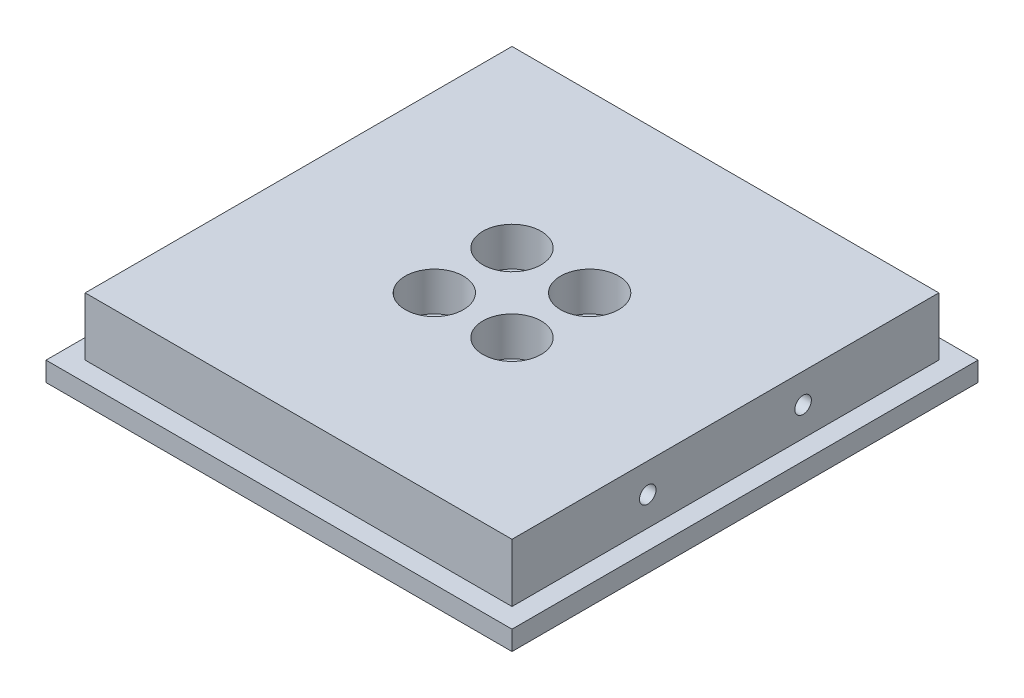
ISO-10303-21;
HEADER;
FILE_DESCRIPTION(('STEP AP214'),'2;1');
FILE_NAME('part.step','',(''),(''),'','','');
FILE_SCHEMA(('AUTOMOTIVE_DESIGN { 1 0 10303 214 1 1 1 1 }'));
ENDSEC;
DATA;
#1=APPLICATION_CONTEXT('core data for automotive mechanical design processes');
#2=APPLICATION_PROTOCOL_DEFINITION('international standard','automotive_design',2000,#1);
#3=PRODUCT_CONTEXT('',#1,'mechanical');
#4=PRODUCT('Part','Part','',(#3));
#5=PRODUCT_RELATED_PRODUCT_CATEGORY('part','',(#4));
#6=PRODUCT_DEFINITION_FORMATION('','',#4);
#7=PRODUCT_DEFINITION_CONTEXT('part definition',#1,'design');
#8=PRODUCT_DEFINITION('design','',#6,#7);
#9=PRODUCT_DEFINITION_SHAPE('','',#8);
#10=(LENGTH_UNIT() NAMED_UNIT(*) SI_UNIT(.MILLI.,.METRE.));
#11=(NAMED_UNIT(*) PLANE_ANGLE_UNIT() SI_UNIT($,.RADIAN.));
#12=(NAMED_UNIT(*) SI_UNIT($,.STERADIAN.) SOLID_ANGLE_UNIT());
#13=UNCERTAINTY_MEASURE_WITH_UNIT(LENGTH_MEASURE(1.E-05),#10,'distance_accuracy_value','');
#14=(GEOMETRIC_REPRESENTATION_CONTEXT(3) GLOBAL_UNCERTAINTY_ASSIGNED_CONTEXT((#13)) GLOBAL_UNIT_ASSIGNED_CONTEXT((#10,
#11,#12)) REPRESENTATION_CONTEXT('',''));
#15=CARTESIAN_POINT('',(0.,0.,0.));
#16=DIRECTION('',(0.,0.,1.));
#17=DIRECTION('',(1.,0.,0.));
#18=AXIS2_PLACEMENT_3D('',#15,#16,#17);
#19=CARTESIAN_POINT('',(-6.35,12.7,6.35));
#20=DIRECTION('',(0.,-1.,0.));
#21=DIRECTION('',(0.,0.,-1.));
#22=AXIS2_PLACEMENT_3D('',#19,#20,#21);
#23=CYLINDRICAL_SURFACE('',#22,2.5527);
#24=CARTESIAN_POINT('',(-6.35,3.175,6.35));
#25=DIRECTION('',(0.,-1.,0.));
#26=DIRECTION('',(0.,0.,-1.));
#27=AXIS2_PLACEMENT_3D('',#24,#25,#26);
#28=CIRCLE('',#27,2.5527);
#29=CARTESIAN_POINT('',(-6.35,3.175,3.7973));
#30=VERTEX_POINT('',#29);
#31=EDGE_CURVE('E204',#30,#30,#28,.T.);
#32=ORIENTED_EDGE('',*,*,#31,.T.);
#33=EDGE_LOOP('',(#32));
#34=FACE_BOUND('',#33,.T.);
#35=CARTESIAN_POINT('',(-6.35,6.35,6.35));
#36=DIRECTION('',(0.,1.,0.));
#37=DIRECTION('',(0.,0.,1.));
#38=AXIS2_PLACEMENT_3D('',#35,#36,#37);
#39=CIRCLE('',#38,2.5527);
#40=CARTESIAN_POINT('',(-6.35,6.35,8.9027));
#41=VERTEX_POINT('',#40);
#42=EDGE_CURVE('E41',#41,#41,#39,.F.);
#43=ORIENTED_EDGE('',*,*,#42,.F.);
#44=EDGE_LOOP('',(#43));
#45=FACE_BOUND('',#44,.T.);
#46=ADVANCED_FACE('F37',(#34,#45),#23,.F.);
#47=CARTESIAN_POINT('',(6.35,12.7,6.35));
#48=DIRECTION('',(0.,-1.,0.));
#49=DIRECTION('',(0.,0.,-1.));
#50=AXIS2_PLACEMENT_3D('',#47,#48,#49);
#51=CYLINDRICAL_SURFACE('',#50,2.5527);
#52=CARTESIAN_POINT('',(6.35,3.175,6.35));
#53=DIRECTION('',(0.,-1.,0.));
#54=DIRECTION('',(0.,0.,-1.));
#55=AXIS2_PLACEMENT_3D('',#52,#53,#54);
#56=CIRCLE('',#55,2.5527);
#57=CARTESIAN_POINT('',(6.35,3.175,3.7973));
#58=VERTEX_POINT('',#57);
#59=EDGE_CURVE('E355',#58,#58,#56,.T.);
#60=ORIENTED_EDGE('',*,*,#59,.T.);
#61=EDGE_LOOP('',(#60));
#62=FACE_BOUND('',#61,.T.);
#63=CARTESIAN_POINT('',(6.35,6.35,6.35));
#64=DIRECTION('',(0.,1.,0.));
#65=DIRECTION('',(0.,0.,1.));
#66=AXIS2_PLACEMENT_3D('',#63,#64,#65);
#67=CIRCLE('',#66,2.5527);
#68=CARTESIAN_POINT('',(6.35,6.35,8.9027));
#69=VERTEX_POINT('',#68);
#70=EDGE_CURVE('E325',#69,#69,#67,.F.);
#71=ORIENTED_EDGE('',*,*,#70,.F.);
#72=EDGE_LOOP('',(#71));
#73=FACE_BOUND('',#72,.T.);
#74=ADVANCED_FACE('F380',(#62,#73),#51,.F.);
#75=CARTESIAN_POINT('',(6.35,12.7,-6.35));
#76=DIRECTION('',(0.,-1.,0.));
#77=DIRECTION('',(0.,0.,-1.));
#78=AXIS2_PLACEMENT_3D('',#75,#76,#77);
#79=CYLINDRICAL_SURFACE('',#78,2.5527);
#80=CARTESIAN_POINT('',(6.35,3.175,-6.35));
#81=DIRECTION('',(0.,-1.,0.));
#82=DIRECTION('',(0.,0.,-1.));
#83=AXIS2_PLACEMENT_3D('',#80,#81,#82);
#84=CIRCLE('',#83,2.5527);
#85=CARTESIAN_POINT('',(6.35,3.175,-8.9027));
#86=VERTEX_POINT('',#85);
#87=EDGE_CURVE('E352',#86,#86,#84,.T.);
#88=ORIENTED_EDGE('',*,*,#87,.T.);
#89=EDGE_LOOP('',(#88));
#90=FACE_BOUND('',#89,.T.);
#91=CARTESIAN_POINT('',(6.35,6.35,-6.35));
#92=DIRECTION('',(0.,1.,0.));
#93=DIRECTION('',(0.,0.,1.));
#94=AXIS2_PLACEMENT_3D('',#91,#92,#93);
#95=CIRCLE('',#94,2.5527);
#96=CARTESIAN_POINT('',(6.35,6.35,-3.7973));
#97=VERTEX_POINT('',#96);
#98=EDGE_CURVE('E321',#97,#97,#95,.F.);
#99=ORIENTED_EDGE('',*,*,#98,.F.);
#100=EDGE_LOOP('',(#99));
#101=FACE_BOUND('',#100,.T.);
#102=ADVANCED_FACE('F384',(#90,#101),#79,.F.);
#103=CARTESIAN_POINT('',(-6.35,12.7,-6.35));
#104=DIRECTION('',(0.,-1.,0.));
#105=DIRECTION('',(0.,0.,-1.));
#106=AXIS2_PLACEMENT_3D('',#103,#104,#105);
#107=CYLINDRICAL_SURFACE('',#106,2.5527);
#108=CARTESIAN_POINT('',(-6.35,3.175,-6.35));
#109=DIRECTION('',(0.,-1.,0.));
#110=DIRECTION('',(0.,0.,-1.));
#111=AXIS2_PLACEMENT_3D('',#108,#109,#110);
#112=CIRCLE('',#111,2.5527);
#113=CARTESIAN_POINT('',(-6.35,3.175,-8.9027));
#114=VERTEX_POINT('',#113);
#115=EDGE_CURVE('E319',#114,#114,#112,.T.);
#116=ORIENTED_EDGE('',*,*,#115,.T.);
#117=EDGE_LOOP('',(#116));
#118=FACE_BOUND('',#117,.T.);
#119=CARTESIAN_POINT('',(-6.35,6.35,-6.35));
#120=DIRECTION('',(0.,1.,0.));
#121=DIRECTION('',(0.,0.,1.));
#122=AXIS2_PLACEMENT_3D('',#119,#120,#121);
#123=CIRCLE('',#122,2.5527);
#124=CARTESIAN_POINT('',(-6.35,6.35,-3.7973));
#125=VERTEX_POINT('',#124);
#126=EDGE_CURVE('E316',#125,#125,#123,.F.);
#127=ORIENTED_EDGE('',*,*,#126,.F.);
#128=EDGE_LOOP('',(#127));
#129=FACE_BOUND('',#128,.T.);
#130=ADVANCED_FACE('F390',(#118,#129),#107,.F.);
#131=CARTESIAN_POINT('',(0.,0.,0.));
#132=DIRECTION('',(0.,-1.,0.));
#133=DIRECTION('',(0.,0.,-1.));
#134=AXIS2_PLACEMENT_3D('',#131,#132,#133);
#135=PLANE('',#134);
#136=DIRECTION('',(0.,0.,-1.));
#137=VECTOR('',#136,1.);
#138=CARTESIAN_POINT('',(38.1,0.,38.1));
#139=LINE('',#138,#137);
#140=CARTESIAN_POINT('',(38.1,0.,38.1));
#141=VERTEX_POINT('',#140);
#142=CARTESIAN_POINT('',(38.1,0.,-38.1));
#143=VERTEX_POINT('',#142);
#144=EDGE_CURVE('E290',#141,#143,#139,.T.);
#145=ORIENTED_EDGE('',*,*,#144,.F.);
#146=DIRECTION('',(1.,0.,0.));
#147=VECTOR('',#146,1.);
#148=CARTESIAN_POINT('',(-38.1,0.,38.1));
#149=LINE('',#148,#147);
#150=CARTESIAN_POINT('',(-38.1,0.,38.1));
#151=VERTEX_POINT('',#150);
#152=EDGE_CURVE('E295',#151,#141,#149,.T.);
#153=ORIENTED_EDGE('',*,*,#152,.F.);
#154=DIRECTION('',(0.,0.,1.));
#155=VECTOR('',#154,1.);
#156=CARTESIAN_POINT('',(-38.1,0.,38.1));
#157=LINE('',#156,#155);
#158=CARTESIAN_POINT('',(-38.1,0.,-38.1));
#159=VERTEX_POINT('',#158);
#160=EDGE_CURVE('E306',#159,#151,#157,.T.);
#161=ORIENTED_EDGE('',*,*,#160,.F.);
#162=DIRECTION('',(-1.,0.,0.));
#163=VECTOR('',#162,1.);
#164=CARTESIAN_POINT('',(-38.1,0.,-38.1));
#165=LINE('',#164,#163);
#166=EDGE_CURVE('E304',#143,#159,#165,.T.);
#167=ORIENTED_EDGE('',*,*,#166,.F.);
#168=EDGE_LOOP('',(#145,#153,#161,#167));
#169=FACE_BOUND('',#168,.T.);
#170=CARTESIAN_POINT('',(-12.7,0.,-7.9375));
#171=DIRECTION('',(0.,-1.,0.));
#172=DIRECTION('',(0.,0.,-1.));
#173=AXIS2_PLACEMENT_3D('',#170,#171,#172);
#174=CIRCLE('',#173,4.7625);
#175=CARTESIAN_POINT('',(-12.7,0.,-3.175));
#176=VERTEX_POINT('',#175);
#177=CARTESIAN_POINT('',(-12.7,0.,-12.7));
#178=VERTEX_POINT('',#177);
#179=EDGE_CURVE('E203',#176,#178,#174,.T.);
#180=ORIENTED_EDGE('',*,*,#179,.F.);
#181=DIRECTION('',(0.,0.,1.));
#182=VECTOR('',#181,1.);
#183=CARTESIAN_POINT('',(-12.7,0.,0.));
#184=LINE('',#183,#182);
#185=CARTESIAN_POINT('',(-12.7,0.,12.7));
#186=VERTEX_POINT('',#185);
#187=EDGE_CURVE('E54',#176,#186,#184,.T.);
#188=ORIENTED_EDGE('',*,*,#187,.T.);
#189=CARTESIAN_POINT('',(-7.9375,0.,12.7));
#190=DIRECTION('',(0.,-1.,0.));
#191=DIRECTION('',(0.,0.,-1.));
#192=AXIS2_PLACEMENT_3D('',#189,#190,#191);
#193=CIRCLE('',#192,4.7625);
#194=CARTESIAN_POINT('',(-3.175,0.,12.7));
#195=VERTEX_POINT('',#194);
#196=EDGE_CURVE('E181',#195,#186,#193,.T.);
#197=ORIENTED_EDGE('',*,*,#196,.F.);
#198=DIRECTION('',(1.,0.,0.));
#199=VECTOR('',#198,1.);
#200=CARTESIAN_POINT('',(0.,0.,12.7));
#201=LINE('',#200,#199);
#202=CARTESIAN_POINT('',(12.7,0.,12.7));
#203=VERTEX_POINT('',#202);
#204=EDGE_CURVE('E218',#195,#203,#201,.T.);
#205=ORIENTED_EDGE('',*,*,#204,.T.);
#206=CARTESIAN_POINT('',(12.7,0.,7.9375));
#207=DIRECTION('',(0.,-1.,0.));
#208=DIRECTION('',(0.,0.,-1.));
#209=AXIS2_PLACEMENT_3D('',#206,#207,#208);
#210=CIRCLE('',#209,4.7625);
#211=CARTESIAN_POINT('',(12.7,0.,3.175));
#212=VERTEX_POINT('',#211);
#213=EDGE_CURVE('E215',#212,#203,#210,.T.);
#214=ORIENTED_EDGE('',*,*,#213,.F.);
#215=DIRECTION('',(0.,0.,1.));
#216=VECTOR('',#215,1.);
#217=CARTESIAN_POINT('',(12.7,0.,0.));
#218=LINE('',#217,#216);
#219=CARTESIAN_POINT('',(12.7,0.,-12.7));
#220=VERTEX_POINT('',#219);
#221=EDGE_CURVE('E212',#220,#212,#218,.T.);
#222=ORIENTED_EDGE('',*,*,#221,.F.);
#223=CARTESIAN_POINT('',(7.9375,0.,-12.7));
#224=DIRECTION('',(0.,-1.,0.));
#225=DIRECTION('',(0.,0.,-1.));
#226=AXIS2_PLACEMENT_3D('',#223,#224,#225);
#227=CIRCLE('',#226,4.7625);
#228=CARTESIAN_POINT('',(3.175,0.,-12.7));
#229=VERTEX_POINT('',#228);
#230=EDGE_CURVE('E209',#229,#220,#227,.T.);
#231=ORIENTED_EDGE('',*,*,#230,.F.);
#232=DIRECTION('',(1.,0.,0.));
#233=VECTOR('',#232,1.);
#234=CARTESIAN_POINT('',(0.,0.,-12.7));
#235=LINE('',#234,#233);
#236=EDGE_CURVE('E206',#178,#229,#235,.T.);
#237=ORIENTED_EDGE('',*,*,#236,.F.);
#238=EDGE_LOOP('',(#180,#188,#197,#205,#214,#222,#231,#237));
#239=FACE_BOUND('',#238,.T.);
#240=ADVANCED_FACE('F394',(#169,#239),#135,.T.);
#241=CARTESIAN_POINT('',(38.1,3.175,38.1));
#242=DIRECTION('',(-1.,0.,0.));
#243=DIRECTION('',(0.,0.,1.));
#244=AXIS2_PLACEMENT_3D('',#241,#242,#243);
#245=PLANE('',#244);
#246=ORIENTED_EDGE('',*,*,#144,.T.);
#247=DIRECTION('',(0.,-1.,0.));
#248=VECTOR('',#247,1.);
#249=CARTESIAN_POINT('',(38.1,3.175,-38.1));
#250=LINE('',#249,#248);
#251=CARTESIAN_POINT('',(38.1,3.175,-38.1));
#252=VERTEX_POINT('',#251);
#253=EDGE_CURVE('E11',#252,#143,#250,.T.);
#254=ORIENTED_EDGE('',*,*,#253,.F.);
#255=DIRECTION('',(0.,0.,-1.));
#256=VECTOR('',#255,1.);
#257=CARTESIAN_POINT('',(38.1,3.175,38.1));
#258=LINE('',#257,#256);
#259=CARTESIAN_POINT('',(38.1,3.175,38.1));
#260=VERTEX_POINT('',#259);
#261=EDGE_CURVE('E291',#260,#252,#258,.T.);
#262=ORIENTED_EDGE('',*,*,#261,.F.);
#263=DIRECTION('',(0.,-1.,0.));
#264=VECTOR('',#263,1.);
#265=CARTESIAN_POINT('',(38.1,3.175,38.1));
#266=LINE('',#265,#264);
#267=EDGE_CURVE('E301',#260,#141,#266,.T.);
#268=ORIENTED_EDGE('',*,*,#267,.T.);
#269=EDGE_LOOP('',(#246,#254,#262,#268));
#270=FACE_BOUND('',#269,.T.);
#271=ADVANCED_FACE('F39',(#270),#245,.F.);
#272=CARTESIAN_POINT('',(-38.1,3.175,-38.1));
#273=DIRECTION('',(0.,0.,1.));
#274=DIRECTION('',(1.,0.,0.));
#275=AXIS2_PLACEMENT_3D('',#272,#273,#274);
#276=PLANE('',#275);
#277=ORIENTED_EDGE('',*,*,#166,.T.);
#278=DIRECTION('',(0.,-1.,0.));
#279=VECTOR('',#278,1.);
#280=CARTESIAN_POINT('',(-38.1,3.175,-38.1));
#281=LINE('',#280,#279);
#282=CARTESIAN_POINT('',(-38.1,3.175,-38.1));
#283=VERTEX_POINT('',#282);
#284=EDGE_CURVE('E46',#283,#159,#281,.T.);
#285=ORIENTED_EDGE('',*,*,#284,.F.);
#286=DIRECTION('',(-1.,0.,0.));
#287=VECTOR('',#286,1.);
#288=CARTESIAN_POINT('',(-38.1,3.175,-38.1));
#289=LINE('',#288,#287);
#290=EDGE_CURVE('E294',#252,#283,#289,.T.);
#291=ORIENTED_EDGE('',*,*,#290,.F.);
#292=ORIENTED_EDGE('',*,*,#253,.T.);
#293=EDGE_LOOP('',(#277,#285,#291,#292));
#294=FACE_BOUND('',#293,.T.);
#295=ADVANCED_FACE('F472',(#294),#276,.F.);
#296=CARTESIAN_POINT('',(-38.1,3.175,38.1));
#297=DIRECTION('',(1.,0.,0.));
#298=DIRECTION('',(0.,0.,-1.));
#299=AXIS2_PLACEMENT_3D('',#296,#297,#298);
#300=PLANE('',#299);
#301=ORIENTED_EDGE('',*,*,#160,.T.);
#302=DIRECTION('',(0.,-1.,0.));
#303=VECTOR('',#302,1.);
#304=CARTESIAN_POINT('',(-38.1,3.175,38.1));
#305=LINE('',#304,#303);
#306=CARTESIAN_POINT('',(-38.1,3.175,38.1));
#307=VERTEX_POINT('',#306);
#308=EDGE_CURVE('E311',#307,#151,#305,.T.);
#309=ORIENTED_EDGE('',*,*,#308,.F.);
#310=DIRECTION('',(0.,0.,1.));
#311=VECTOR('',#310,1.);
#312=CARTESIAN_POINT('',(-38.1,3.175,38.1));
#313=LINE('',#312,#311);
#314=EDGE_CURVE('E297',#283,#307,#313,.T.);
#315=ORIENTED_EDGE('',*,*,#314,.F.);
#316=ORIENTED_EDGE('',*,*,#284,.T.);
#317=EDGE_LOOP('',(#301,#309,#315,#316));
#318=FACE_BOUND('',#317,.T.);
#319=ADVANCED_FACE('F477',(#318),#300,.F.);
#320=CARTESIAN_POINT('',(-38.1,3.175,38.1));
#321=DIRECTION('',(0.,0.,-1.));
#322=DIRECTION('',(-1.,0.,0.));
#323=AXIS2_PLACEMENT_3D('',#320,#321,#322);
#324=PLANE('',#323);
#325=ORIENTED_EDGE('',*,*,#152,.T.);
#326=ORIENTED_EDGE('',*,*,#267,.F.);
#327=DIRECTION('',(1.,0.,0.));
#328=VECTOR('',#327,1.);
#329=CARTESIAN_POINT('',(-38.1,3.175,38.1));
#330=LINE('',#329,#328);
#331=EDGE_CURVE('E299',#307,#260,#330,.T.);
#332=ORIENTED_EDGE('',*,*,#331,.F.);
#333=ORIENTED_EDGE('',*,*,#308,.T.);
#334=EDGE_LOOP('',(#325,#326,#332,#333));
#335=FACE_BOUND('',#334,.T.);
#336=ADVANCED_FACE('F462',(#335),#324,.F.);
#337=CARTESIAN_POINT('',(0.,3.175,0.));
#338=DIRECTION('',(0.,-1.,0.));
#339=DIRECTION('',(0.,0.,-1.));
#340=AXIS2_PLACEMENT_3D('',#337,#338,#339);
#341=PLANE('',#340);
#342=DIRECTION('',(-1.,0.,0.));
#343=VECTOR('',#342,1.);
#344=CARTESIAN_POINT('',(0.,3.175,34.89706));
#345=LINE('',#344,#343);
#346=CARTESIAN_POINT('',(34.89706,3.175,34.89706));
#347=VERTEX_POINT('',#346);
#348=CARTESIAN_POINT('',(-34.89706,3.175,34.89706));
#349=VERTEX_POINT('',#348);
#350=EDGE_CURVE('E62',#347,#349,#345,.T.);
#351=ORIENTED_EDGE('',*,*,#350,.T.);
#352=DIRECTION('',(0.,0.,-1.));
#353=VECTOR('',#352,1.);
#354=CARTESIAN_POINT('',(-34.89706,3.175,0.));
#355=LINE('',#354,#353);
#356=CARTESIAN_POINT('',(-34.89706,3.175,-34.89706));
#357=VERTEX_POINT('',#356);
#358=EDGE_CURVE('E260',#349,#357,#355,.T.);
#359=ORIENTED_EDGE('',*,*,#358,.T.);
#360=DIRECTION('',(-1.,0.,0.));
#361=VECTOR('',#360,1.);
#362=CARTESIAN_POINT('',(0.,3.175,-34.89706));
#363=LINE('',#362,#361);
#364=CARTESIAN_POINT('',(34.89706,3.175,-34.89706));
#365=VERTEX_POINT('',#364);
#366=EDGE_CURVE('E265',#365,#357,#363,.T.);
#367=ORIENTED_EDGE('',*,*,#366,.F.);
#368=DIRECTION('',(0.,0.,-1.));
#369=VECTOR('',#368,1.);
#370=CARTESIAN_POINT('',(34.89706,3.175,0.));
#371=LINE('',#370,#369);
#372=EDGE_CURVE('E275',#347,#365,#371,.T.);
#373=ORIENTED_EDGE('',*,*,#372,.F.);
#374=EDGE_LOOP('',(#351,#359,#367,#373));
#375=FACE_BOUND('',#374,.T.);
#376=ORIENTED_EDGE('',*,*,#261,.T.);
#377=ORIENTED_EDGE('',*,*,#290,.T.);
#378=ORIENTED_EDGE('',*,*,#314,.T.);
#379=ORIENTED_EDGE('',*,*,#331,.T.);
#380=EDGE_LOOP('',(#376,#377,#378,#379));
#381=FACE_BOUND('',#380,.T.);
#382=ADVANCED_FACE('F459',(#375,#381),#341,.F.);
#383=CARTESIAN_POINT('',(-34.89706,12.7,0.));
#384=DIRECTION('',(-1.,0.,0.));
#385=DIRECTION('',(0.,0.,1.));
#386=AXIS2_PLACEMENT_3D('',#383,#384,#385);
#387=PLANE('',#386);
#388=CARTESIAN_POINT('',(-34.89706,7.9375,12.7));
#389=DIRECTION('',(-1.,0.,0.));
#390=DIRECTION('',(0.,0.,1.));
#391=AXIS2_PLACEMENT_3D('',#388,#389,#390);
#392=CIRCLE('',#391,1.35255);
#393=CARTESIAN_POINT('',(-34.89706,7.9375,14.05255));
#394=VERTEX_POINT('',#393);
#395=EDGE_CURVE('E225',#394,#394,#392,.T.);
#396=ORIENTED_EDGE('',*,*,#395,.F.);
#397=EDGE_LOOP('',(#396));
#398=FACE_BOUND('',#397,.T.);
#399=CARTESIAN_POINT('',(-34.89706,7.9375,-12.7));
#400=DIRECTION('',(-1.,0.,0.));
#401=DIRECTION('',(0.,0.,1.));
#402=AXIS2_PLACEMENT_3D('',#399,#400,#401);
#403=CIRCLE('',#402,1.35255);
#404=CARTESIAN_POINT('',(-34.89706,7.9375,-11.34745));
#405=VERTEX_POINT('',#404);
#406=EDGE_CURVE('E242',#405,#405,#403,.T.);
#407=ORIENTED_EDGE('',*,*,#406,.F.);
#408=EDGE_LOOP('',(#407));
#409=FACE_BOUND('',#408,.T.);
#410=ORIENTED_EDGE('',*,*,#358,.F.);
#411=DIRECTION('',(0.,-1.,0.));
#412=VECTOR('',#411,1.);
#413=CARTESIAN_POINT('',(-34.89706,12.7,34.89706));
#414=LINE('',#413,#412);
#415=CARTESIAN_POINT('',(-34.89706,12.7,34.89706));
#416=VERTEX_POINT('',#415);
#417=EDGE_CURVE('E288',#416,#349,#414,.T.);
#418=ORIENTED_EDGE('',*,*,#417,.F.);
#419=DIRECTION('',(0.,0.,-1.));
#420=VECTOR('',#419,1.);
#421=CARTESIAN_POINT('',(-34.89706,12.7,0.));
#422=LINE('',#421,#420);
#423=CARTESIAN_POINT('',(-34.89706,12.7,-34.89706));
#424=VERTEX_POINT('',#423);
#425=EDGE_CURVE('E261',#416,#424,#422,.T.);
#426=ORIENTED_EDGE('',*,*,#425,.T.);
#427=DIRECTION('',(0.,-1.,0.));
#428=VECTOR('',#427,1.);
#429=CARTESIAN_POINT('',(-34.89706,12.7,-34.89706));
#430=LINE('',#429,#428);
#431=EDGE_CURVE('E272',#424,#357,#430,.T.);
#432=ORIENTED_EDGE('',*,*,#431,.T.);
#433=EDGE_LOOP('',(#410,#418,#426,#432));
#434=FACE_BOUND('',#433,.T.);
#435=ADVANCED_FACE('F458',(#398,#409,#434),#387,.T.);
#436=CARTESIAN_POINT('',(0.,12.7,34.89706));
#437=DIRECTION('',(0.,0.,1.));
#438=DIRECTION('',(1.,0.,0.));
#439=AXIS2_PLACEMENT_3D('',#436,#437,#438);
#440=PLANE('',#439);
#441=ORIENTED_EDGE('',*,*,#350,.F.);
#442=DIRECTION('',(0.,-1.,0.));
#443=VECTOR('',#442,1.);
#444=CARTESIAN_POINT('',(34.89706,12.7,34.89706));
#445=LINE('',#444,#443);
#446=CARTESIAN_POINT('',(34.89706,12.7,34.89706));
#447=VERTEX_POINT('',#446);
#448=EDGE_CURVE('E285',#447,#347,#445,.T.);
#449=ORIENTED_EDGE('',*,*,#448,.F.);
#450=DIRECTION('',(-1.,0.,0.));
#451=VECTOR('',#450,1.);
#452=CARTESIAN_POINT('',(0.,12.7,34.89706));
#453=LINE('',#452,#451);
#454=EDGE_CURVE('E264',#447,#416,#453,.T.);
#455=ORIENTED_EDGE('',*,*,#454,.T.);
#456=ORIENTED_EDGE('',*,*,#417,.T.);
#457=EDGE_LOOP('',(#441,#449,#455,#456));
#458=FACE_BOUND('',#457,.T.);
#459=ADVANCED_FACE('F451',(#458),#440,.T.);
#460=CARTESIAN_POINT('',(34.89706,12.7,0.));
#461=DIRECTION('',(-1.,0.,0.));
#462=DIRECTION('',(0.,0.,1.));
#463=AXIS2_PLACEMENT_3D('',#460,#461,#462);
#464=PLANE('',#463);
#465=CARTESIAN_POINT('',(34.89706,7.9375,-12.7));
#466=DIRECTION('',(1.,0.,0.));
#467=DIRECTION('',(0.,0.,-1.));
#468=AXIS2_PLACEMENT_3D('',#465,#466,#467);
#469=CIRCLE('',#468,1.35255);
#470=CARTESIAN_POINT('',(34.89706,7.9375,-14.05255));
#471=VERTEX_POINT('',#470);
#472=EDGE_CURVE('E248',#471,#471,#469,.T.);
#473=ORIENTED_EDGE('',*,*,#472,.F.);
#474=EDGE_LOOP('',(#473));
#475=FACE_BOUND('',#474,.T.);
#476=CARTESIAN_POINT('',(34.89706,7.9375,12.7));
#477=DIRECTION('',(1.,0.,0.));
#478=DIRECTION('',(0.,0.,-1.));
#479=AXIS2_PLACEMENT_3D('',#476,#477,#478);
#480=CIRCLE('',#479,1.35255);
#481=CARTESIAN_POINT('',(34.89706,7.9375,11.34745));
#482=VERTEX_POINT('',#481);
#483=EDGE_CURVE('E254',#482,#482,#480,.T.);
#484=ORIENTED_EDGE('',*,*,#483,.F.);
#485=EDGE_LOOP('',(#484));
#486=FACE_BOUND('',#485,.T.);
#487=ORIENTED_EDGE('',*,*,#372,.T.);
#488=DIRECTION('',(0.,-1.,0.));
#489=VECTOR('',#488,1.);
#490=CARTESIAN_POINT('',(34.89706,12.7,-34.89706));
#491=LINE('',#490,#489);
#492=CARTESIAN_POINT('',(34.89706,12.7,-34.89706));
#493=VERTEX_POINT('',#492);
#494=EDGE_CURVE('E282',#493,#365,#491,.T.);
#495=ORIENTED_EDGE('',*,*,#494,.F.);
#496=DIRECTION('',(0.,0.,-1.));
#497=VECTOR('',#496,1.);
#498=CARTESIAN_POINT('',(34.89706,12.7,0.));
#499=LINE('',#498,#497);
#500=EDGE_CURVE('E268',#447,#493,#499,.T.);
#501=ORIENTED_EDGE('',*,*,#500,.F.);
#502=ORIENTED_EDGE('',*,*,#448,.T.);
#503=EDGE_LOOP('',(#487,#495,#501,#502));
#504=FACE_BOUND('',#503,.T.);
#505=ADVANCED_FACE('F456',(#475,#486,#504),#464,.F.);
#506=CARTESIAN_POINT('',(0.,12.7,-34.89706));
#507=DIRECTION('',(0.,0.,1.));
#508=DIRECTION('',(1.,0.,0.));
#509=AXIS2_PLACEMENT_3D('',#506,#507,#508);
#510=PLANE('',#509);
#511=ORIENTED_EDGE('',*,*,#366,.T.);
#512=ORIENTED_EDGE('',*,*,#431,.F.);
#513=DIRECTION('',(-1.,0.,0.));
#514=VECTOR('',#513,1.);
#515=CARTESIAN_POINT('',(0.,12.7,-34.89706));
#516=LINE('',#515,#514);
#517=EDGE_CURVE('E270',#493,#424,#516,.T.);
#518=ORIENTED_EDGE('',*,*,#517,.F.);
#519=ORIENTED_EDGE('',*,*,#494,.T.);
#520=EDGE_LOOP('',(#511,#512,#518,#519));
#521=FACE_BOUND('',#520,.T.);
#522=ADVANCED_FACE('F437',(#521),#510,.F.);
#523=CARTESIAN_POINT('',(0.,12.7,0.));
#524=DIRECTION('',(0.,1.,0.));
#525=DIRECTION('',(0.,0.,1.));
#526=AXIS2_PLACEMENT_3D('',#523,#524,#525);
#527=PLANE('',#526);
#528=CARTESIAN_POINT('',(-6.35,12.7,6.35));
#529=DIRECTION('',(0.,1.,0.));
#530=DIRECTION('',(0.,0.,1.));
#531=AXIS2_PLACEMENT_3D('',#528,#529,#530);
#532=CIRCLE('',#531,4.7625);
#533=CARTESIAN_POINT('',(-6.35,12.7,11.1125));
#534=VERTEX_POINT('',#533);
#535=EDGE_CURVE('E341',#534,#534,#532,.T.);
#536=ORIENTED_EDGE('',*,*,#535,.F.);
#537=EDGE_LOOP('',(#536));
#538=FACE_BOUND('',#537,.T.);
#539=CARTESIAN_POINT('',(6.35,12.7,6.35));
#540=DIRECTION('',(0.,1.,0.));
#541=DIRECTION('',(0.,0.,1.));
#542=AXIS2_PLACEMENT_3D('',#539,#540,#541);
#543=CIRCLE('',#542,4.7625);
#544=CARTESIAN_POINT('',(6.35,12.7,11.1125));
#545=VERTEX_POINT('',#544);
#546=EDGE_CURVE('E334',#545,#545,#543,.T.);
#547=ORIENTED_EDGE('',*,*,#546,.F.);
#548=EDGE_LOOP('',(#547));
#549=FACE_BOUND('',#548,.T.);
#550=CARTESIAN_POINT('',(6.35,12.7,-6.35));
#551=DIRECTION('',(0.,1.,0.));
#552=DIRECTION('',(0.,0.,1.));
#553=AXIS2_PLACEMENT_3D('',#550,#551,#552);
#554=CIRCLE('',#553,4.7625);
#555=CARTESIAN_POINT('',(6.35,12.7,-1.5875));
#556=VERTEX_POINT('',#555);
#557=EDGE_CURVE('E327',#556,#556,#554,.T.);
#558=ORIENTED_EDGE('',*,*,#557,.F.);
#559=EDGE_LOOP('',(#558));
#560=FACE_BOUND('',#559,.T.);
#561=CARTESIAN_POINT('',(-6.35,12.7,-6.35));
#562=DIRECTION('',(0.,1.,0.));
#563=DIRECTION('',(0.,0.,1.));
#564=AXIS2_PLACEMENT_3D('',#561,#562,#563);
#565=CIRCLE('',#564,4.7625);
#566=CARTESIAN_POINT('',(-6.35,12.7,-1.5875));
#567=VERTEX_POINT('',#566);
#568=EDGE_CURVE('E323',#567,#567,#565,.T.);
#569=ORIENTED_EDGE('',*,*,#568,.F.);
#570=EDGE_LOOP('',(#569));
#571=FACE_BOUND('',#570,.T.);
#572=ORIENTED_EDGE('',*,*,#425,.F.);
#573=ORIENTED_EDGE('',*,*,#454,.F.);
#574=ORIENTED_EDGE('',*,*,#500,.T.);
#575=ORIENTED_EDGE('',*,*,#517,.T.);
#576=EDGE_LOOP('',(#572,#573,#574,#575));
#577=FACE_BOUND('',#576,.T.);
#578=ADVANCED_FACE('F433',(#538,#549,#560,#571,#577),#527,.T.);
#579=CARTESIAN_POINT('',(23.72106,7.9375,12.7));
#580=DIRECTION('',(1.,0.,0.));
#581=DIRECTION('',(0.,0.,-1.));
#582=AXIS2_PLACEMENT_3D('',#579,#580,#581);
#583=CONICAL_SURFACE('',#582,1.35255,1.02974425867665);
#584=CARTESIAN_POINT('',(22.9083659697343,7.9375,12.7));
#585=VERTEX_POINT('',#584);
#586=VERTEX_LOOP('',#585);
#587=FACE_BOUND('',#586,.T.);
#588=CARTESIAN_POINT('',(23.72106,7.9375,12.7));
#589=DIRECTION('',(1.,0.,0.));
#590=DIRECTION('',(0.,0.,-1.));
#591=AXIS2_PLACEMENT_3D('',#588,#589,#590);
#592=CIRCLE('',#591,1.35255);
#593=CARTESIAN_POINT('',(23.72106,7.9375,11.34745));
#594=VERTEX_POINT('',#593);
#595=EDGE_CURVE('E257',#594,#594,#592,.T.);
#596=ORIENTED_EDGE('',*,*,#595,.T.);
#597=EDGE_LOOP('',(#596));
#598=FACE_BOUND('',#597,.T.);
#599=ADVANCED_FACE('F436',(#587,#598),#583,.F.);
#600=CARTESIAN_POINT('',(34.89706,7.9375,12.7));
#601=DIRECTION('',(1.,0.,0.));
#602=DIRECTION('',(0.,0.,-1.));
#603=AXIS2_PLACEMENT_3D('',#600,#601,#602);
#604=CYLINDRICAL_SURFACE('',#603,1.35255);
#605=ORIENTED_EDGE('',*,*,#595,.F.);
#606=EDGE_LOOP('',(#605));
#607=FACE_BOUND('',#606,.T.);
#608=ORIENTED_EDGE('',*,*,#483,.T.);
#609=EDGE_LOOP('',(#608));
#610=FACE_BOUND('',#609,.T.);
#611=ADVANCED_FACE('F544',(#607,#610),#604,.F.);
#612=CARTESIAN_POINT('',(23.72106,7.9375,-12.7));
#613=DIRECTION('',(1.,0.,0.));
#614=DIRECTION('',(0.,0.,-1.));
#615=AXIS2_PLACEMENT_3D('',#612,#613,#614);
#616=CONICAL_SURFACE('',#615,1.35255,1.02974425867665);
#617=CARTESIAN_POINT('',(22.9083659697343,7.9375,-12.7));
#618=VERTEX_POINT('',#617);
#619=VERTEX_LOOP('',#618);
#620=FACE_BOUND('',#619,.T.);
#621=CARTESIAN_POINT('',(23.72106,7.9375,-12.7));
#622=DIRECTION('',(1.,0.,0.));
#623=DIRECTION('',(0.,0.,-1.));
#624=AXIS2_PLACEMENT_3D('',#621,#622,#623);
#625=CIRCLE('',#624,1.35255);
#626=CARTESIAN_POINT('',(23.72106,7.9375,-14.05255));
#627=VERTEX_POINT('',#626);
#628=EDGE_CURVE('E251',#627,#627,#625,.T.);
#629=ORIENTED_EDGE('',*,*,#628,.T.);
#630=EDGE_LOOP('',(#629));
#631=FACE_BOUND('',#630,.T.);
#632=ADVANCED_FACE('F540',(#620,#631),#616,.F.);
#633=CARTESIAN_POINT('',(34.89706,7.9375,-12.7));
#634=DIRECTION('',(1.,0.,0.));
#635=DIRECTION('',(0.,0.,-1.));
#636=AXIS2_PLACEMENT_3D('',#633,#634,#635);
#637=CYLINDRICAL_SURFACE('',#636,1.35255);
#638=ORIENTED_EDGE('',*,*,#628,.F.);
#639=EDGE_LOOP('',(#638));
#640=FACE_BOUND('',#639,.T.);
#641=ORIENTED_EDGE('',*,*,#472,.T.);
#642=EDGE_LOOP('',(#641));
#643=FACE_BOUND('',#642,.T.);
#644=ADVANCED_FACE('F536',(#640,#643),#637,.F.);
#645=CARTESIAN_POINT('',(-23.72106,7.9375,-12.7));
#646=DIRECTION('',(-1.,0.,0.));
#647=DIRECTION('',(0.,0.,1.));
#648=AXIS2_PLACEMENT_3D('',#645,#646,#647);
#649=CONICAL_SURFACE('',#648,1.35255,1.02974425867665);
#650=CARTESIAN_POINT('',(-22.9083659697343,7.9375,-12.7));
#651=VERTEX_POINT('',#650);
#652=VERTEX_LOOP('',#651);
#653=FACE_BOUND('',#652,.T.);
#654=CARTESIAN_POINT('',(-23.72106,7.9375,-12.7));
#655=DIRECTION('',(-1.,0.,0.));
#656=DIRECTION('',(0.,0.,1.));
#657=AXIS2_PLACEMENT_3D('',#654,#655,#656);
#658=CIRCLE('',#657,1.35255);
#659=CARTESIAN_POINT('',(-23.72106,7.9375,-11.34745));
#660=VERTEX_POINT('',#659);
#661=EDGE_CURVE('E245',#660,#660,#658,.T.);
#662=ORIENTED_EDGE('',*,*,#661,.T.);
#663=EDGE_LOOP('',(#662));
#664=FACE_BOUND('',#663,.T.);
#665=ADVANCED_FACE('F532',(#653,#664),#649,.F.);
#666=CARTESIAN_POINT('',(-34.89706,7.9375,-12.7));
#667=DIRECTION('',(-1.,0.,0.));
#668=DIRECTION('',(0.,0.,1.));
#669=AXIS2_PLACEMENT_3D('',#666,#667,#668);
#670=CYLINDRICAL_SURFACE('',#669,1.35255);
#671=ORIENTED_EDGE('',*,*,#661,.F.);
#672=EDGE_LOOP('',(#671));
#673=FACE_BOUND('',#672,.T.);
#674=ORIENTED_EDGE('',*,*,#406,.T.);
#675=EDGE_LOOP('',(#674));
#676=FACE_BOUND('',#675,.T.);
#677=ADVANCED_FACE('F528',(#673,#676),#670,.F.);
#678=CARTESIAN_POINT('',(-23.72106,7.9375,12.7));
#679=DIRECTION('',(-1.,0.,0.));
#680=DIRECTION('',(0.,0.,1.));
#681=AXIS2_PLACEMENT_3D('',#678,#679,#680);
#682=CONICAL_SURFACE('',#681,1.35255,1.02974425867665);
#683=CARTESIAN_POINT('',(-22.9083659697343,7.9375,12.7));
#684=VERTEX_POINT('',#683);
#685=VERTEX_LOOP('',#684);
#686=FACE_BOUND('',#685,.T.);
#687=CARTESIAN_POINT('',(-23.72106,7.9375,12.7));
#688=DIRECTION('',(-1.,0.,0.));
#689=DIRECTION('',(0.,0.,1.));
#690=AXIS2_PLACEMENT_3D('',#687,#688,#689);
#691=CIRCLE('',#690,1.35255);
#692=CARTESIAN_POINT('',(-23.72106,7.9375,14.05255));
#693=VERTEX_POINT('',#692);
#694=EDGE_CURVE('E239',#693,#693,#691,.T.);
#695=ORIENTED_EDGE('',*,*,#694,.T.);
#696=EDGE_LOOP('',(#695));
#697=FACE_BOUND('',#696,.T.);
#698=ADVANCED_FACE('F524',(#686,#697),#682,.F.);
#699=CARTESIAN_POINT('',(-34.89706,7.9375,12.7));
#700=DIRECTION('',(-1.,0.,0.));
#701=DIRECTION('',(0.,0.,1.));
#702=AXIS2_PLACEMENT_3D('',#699,#700,#701);
#703=CYLINDRICAL_SURFACE('',#702,1.35255);
#704=ORIENTED_EDGE('',*,*,#694,.F.);
#705=EDGE_LOOP('',(#704));
#706=FACE_BOUND('',#705,.T.);
#707=ORIENTED_EDGE('',*,*,#395,.T.);
#708=EDGE_LOOP('',(#707));
#709=FACE_BOUND('',#708,.T.);
#710=ADVANCED_FACE('F521',(#706,#709),#703,.F.);
#711=CARTESIAN_POINT('',(-12.7,3.175,0.));
#712=DIRECTION('',(1.,0.,0.));
#713=DIRECTION('',(0.,0.,-1.));
#714=AXIS2_PLACEMENT_3D('',#711,#712,#713);
#715=PLANE('',#714);
#716=ORIENTED_EDGE('',*,*,#187,.F.);
#717=DIRECTION('',(0.,-1.,0.));
#718=VECTOR('',#717,1.);
#719=CARTESIAN_POINT('',(-12.7,3.175,-3.175));
#720=LINE('',#719,#718);
#721=CARTESIAN_POINT('',(-12.7,3.175,-3.175));
#722=VERTEX_POINT('',#721);
#723=EDGE_CURVE('E161',#722,#176,#720,.T.);
#724=ORIENTED_EDGE('',*,*,#723,.F.);
#725=DIRECTION('',(0.,0.,1.));
#726=VECTOR('',#725,1.);
#727=CARTESIAN_POINT('',(-12.7,3.175,0.));
#728=LINE('',#727,#726);
#729=CARTESIAN_POINT('',(-12.7,3.175,12.7));
#730=VERTEX_POINT('',#729);
#731=EDGE_CURVE('E164',#722,#730,#728,.T.);
#732=ORIENTED_EDGE('',*,*,#731,.T.);
#733=DIRECTION('',(0.,-1.,0.));
#734=VECTOR('',#733,1.);
#735=CARTESIAN_POINT('',(-12.7,3.175,12.7));
#736=LINE('',#735,#734);
#737=EDGE_CURVE('E223',#730,#186,#736,.T.);
#738=ORIENTED_EDGE('',*,*,#737,.T.);
#739=EDGE_LOOP('',(#716,#724,#732,#738));
#740=FACE_BOUND('',#739,.T.);
#741=ADVANCED_FACE('F163',(#740),#715,.T.);
#742=CARTESIAN_POINT('',(-7.9375,3.175,12.7));
#743=DIRECTION('',(0.,-1.,0.));
#744=DIRECTION('',(0.,0.,-1.));
#745=AXIS2_PLACEMENT_3D('',#742,#743,#744);
#746=CYLINDRICAL_SURFACE('',#745,4.7625);
#747=ORIENTED_EDGE('',*,*,#196,.T.);
#748=ORIENTED_EDGE('',*,*,#737,.F.);
#749=CARTESIAN_POINT('',(-7.9375,3.175,12.7));
#750=DIRECTION('',(0.,-1.,0.));
#751=DIRECTION('',(0.,0.,-1.));
#752=AXIS2_PLACEMENT_3D('',#749,#750,#751);
#753=CIRCLE('',#752,4.7625);
#754=CARTESIAN_POINT('',(-3.175,3.175,12.7));
#755=VERTEX_POINT('',#754);
#756=EDGE_CURVE('E171',#755,#730,#753,.T.);
#757=ORIENTED_EDGE('',*,*,#756,.F.);
#758=DIRECTION('',(0.,-1.,0.));
#759=VECTOR('',#758,1.);
#760=CARTESIAN_POINT('',(-3.175,3.175,12.7));
#761=LINE('',#760,#759);
#762=EDGE_CURVE('E226',#755,#195,#761,.T.);
#763=ORIENTED_EDGE('',*,*,#762,.T.);
#764=EDGE_LOOP('',(#747,#748,#757,#763));
#765=FACE_BOUND('',#764,.T.);
#766=ADVANCED_FACE('F502',(#765),#746,.F.);
#767=CARTESIAN_POINT('',(0.,3.175,12.7));
#768=DIRECTION('',(0.,0.,-1.));
#769=DIRECTION('',(-1.,0.,0.));
#770=AXIS2_PLACEMENT_3D('',#767,#768,#769);
#771=PLANE('',#770);
#772=ORIENTED_EDGE('',*,*,#204,.F.);
#773=ORIENTED_EDGE('',*,*,#762,.F.);
#774=DIRECTION('',(1.,0.,0.));
#775=VECTOR('',#774,1.);
#776=CARTESIAN_POINT('',(0.,3.175,12.7));
#777=LINE('',#776,#775);
#778=CARTESIAN_POINT('',(12.7,3.175,12.7));
#779=VERTEX_POINT('',#778);
#780=EDGE_CURVE('E199',#755,#779,#777,.T.);
#781=ORIENTED_EDGE('',*,*,#780,.T.);
#782=DIRECTION('',(0.,-1.,0.));
#783=VECTOR('',#782,1.);
#784=CARTESIAN_POINT('',(12.7,3.175,12.7));
#785=LINE('',#784,#783);
#786=EDGE_CURVE('E228',#779,#203,#785,.T.);
#787=ORIENTED_EDGE('',*,*,#786,.T.);
#788=EDGE_LOOP('',(#772,#773,#781,#787));
#789=FACE_BOUND('',#788,.T.);
#790=ADVANCED_FACE('F504',(#789),#771,.T.);
#791=CARTESIAN_POINT('',(12.7,3.175,7.9375));
#792=DIRECTION('',(0.,-1.,0.));
#793=DIRECTION('',(0.,0.,-1.));
#794=AXIS2_PLACEMENT_3D('',#791,#792,#793);
#795=CYLINDRICAL_SURFACE('',#794,4.7625);
#796=ORIENTED_EDGE('',*,*,#213,.T.);
#797=ORIENTED_EDGE('',*,*,#786,.F.);
#798=CARTESIAN_POINT('',(12.7,3.175,7.9375));
#799=DIRECTION('',(0.,-1.,0.));
#800=DIRECTION('',(0.,0.,-1.));
#801=AXIS2_PLACEMENT_3D('',#798,#799,#800);
#802=CIRCLE('',#801,4.7625);
#803=CARTESIAN_POINT('',(12.7,3.175,3.175));
#804=VERTEX_POINT('',#803);
#805=EDGE_CURVE('E196',#804,#779,#802,.T.);
#806=ORIENTED_EDGE('',*,*,#805,.F.);
#807=DIRECTION('',(0.,-1.,0.));
#808=VECTOR('',#807,1.);
#809=CARTESIAN_POINT('',(12.7,3.175,3.175));
#810=LINE('',#809,#808);
#811=EDGE_CURVE('E230',#804,#212,#810,.T.);
#812=ORIENTED_EDGE('',*,*,#811,.T.);
#813=EDGE_LOOP('',(#796,#797,#806,#812));
#814=FACE_BOUND('',#813,.T.);
#815=ADVANCED_FACE('F499',(#814),#795,.F.);
#816=CARTESIAN_POINT('',(12.7,3.175,0.));
#817=DIRECTION('',(1.,0.,0.));
#818=DIRECTION('',(0.,0.,-1.));
#819=AXIS2_PLACEMENT_3D('',#816,#817,#818);
#820=PLANE('',#819);
#821=ORIENTED_EDGE('',*,*,#221,.T.);
#822=ORIENTED_EDGE('',*,*,#811,.F.);
#823=DIRECTION('',(0.,0.,1.));
#824=VECTOR('',#823,1.);
#825=CARTESIAN_POINT('',(12.7,3.175,0.));
#826=LINE('',#825,#824);
#827=CARTESIAN_POINT('',(12.7,3.175,-12.7));
#828=VERTEX_POINT('',#827);
#829=EDGE_CURVE('E193',#828,#804,#826,.T.);
#830=ORIENTED_EDGE('',*,*,#829,.F.);
#831=DIRECTION('',(0.,-1.,0.));
#832=VECTOR('',#831,1.);
#833=CARTESIAN_POINT('',(12.7,3.175,-12.7));
#834=LINE('',#833,#832);
#835=EDGE_CURVE('E232',#828,#220,#834,.T.);
#836=ORIENTED_EDGE('',*,*,#835,.T.);
#837=EDGE_LOOP('',(#821,#822,#830,#836));
#838=FACE_BOUND('',#837,.T.);
#839=ADVANCED_FACE('F494',(#838),#820,.F.);
#840=CARTESIAN_POINT('',(7.9375,3.175,-12.7));
#841=DIRECTION('',(0.,-1.,0.));
#842=DIRECTION('',(0.,0.,-1.));
#843=AXIS2_PLACEMENT_3D('',#840,#841,#842);
#844=CYLINDRICAL_SURFACE('',#843,4.7625);
#845=ORIENTED_EDGE('',*,*,#230,.T.);
#846=ORIENTED_EDGE('',*,*,#835,.F.);
#847=CARTESIAN_POINT('',(7.9375,3.175,-12.7));
#848=DIRECTION('',(0.,-1.,0.));
#849=DIRECTION('',(0.,0.,-1.));
#850=AXIS2_PLACEMENT_3D('',#847,#848,#849);
#851=CIRCLE('',#850,4.7625);
#852=CARTESIAN_POINT('',(3.175,3.175,-12.7));
#853=VERTEX_POINT('',#852);
#854=EDGE_CURVE('E187',#853,#828,#851,.T.);
#855=ORIENTED_EDGE('',*,*,#854,.F.);
#856=DIRECTION('',(0.,-1.,0.));
#857=VECTOR('',#856,1.);
#858=CARTESIAN_POINT('',(3.175,3.175,-12.7));
#859=LINE('',#858,#857);
#860=EDGE_CURVE('E234',#853,#229,#859,.T.);
#861=ORIENTED_EDGE('',*,*,#860,.T.);
#862=EDGE_LOOP('',(#845,#846,#855,#861));
#863=FACE_BOUND('',#862,.T.);
#864=ADVANCED_FACE('F492',(#863),#844,.F.);
#865=CARTESIAN_POINT('',(0.,3.175,-12.7));
#866=DIRECTION('',(0.,0.,-1.));
#867=DIRECTION('',(-1.,0.,0.));
#868=AXIS2_PLACEMENT_3D('',#865,#866,#867);
#869=PLANE('',#868);
#870=ORIENTED_EDGE('',*,*,#236,.T.);
#871=ORIENTED_EDGE('',*,*,#860,.F.);
#872=DIRECTION('',(1.,0.,0.));
#873=VECTOR('',#872,1.);
#874=CARTESIAN_POINT('',(0.,3.175,-12.7));
#875=LINE('',#874,#873);
#876=CARTESIAN_POINT('',(-12.7,3.175,-12.7));
#877=VERTEX_POINT('',#876);
#878=EDGE_CURVE('E185',#877,#853,#875,.T.);
#879=ORIENTED_EDGE('',*,*,#878,.F.);
#880=DIRECTION('',(0.,-1.,0.));
#881=VECTOR('',#880,1.);
#882=CARTESIAN_POINT('',(-12.7,3.175,-12.7));
#883=LINE('',#882,#881);
#884=EDGE_CURVE('E170',#877,#178,#883,.T.);
#885=ORIENTED_EDGE('',*,*,#884,.T.);
#886=EDGE_LOOP('',(#870,#871,#879,#885));
#887=FACE_BOUND('',#886,.T.);
#888=ADVANCED_FACE('F373',(#887),#869,.F.);
#889=CARTESIAN_POINT('',(-12.7,3.175,-7.9375));
#890=DIRECTION('',(0.,-1.,0.));
#891=DIRECTION('',(0.,0.,-1.));
#892=AXIS2_PLACEMENT_3D('',#889,#890,#891);
#893=CYLINDRICAL_SURFACE('',#892,4.7625);
#894=ORIENTED_EDGE('',*,*,#179,.T.);
#895=ORIENTED_EDGE('',*,*,#884,.F.);
#896=CARTESIAN_POINT('',(-12.7,3.175,-7.9375));
#897=DIRECTION('',(0.,-1.,0.));
#898=DIRECTION('',(0.,0.,-1.));
#899=AXIS2_PLACEMENT_3D('',#896,#897,#898);
#900=CIRCLE('',#899,4.7625);
#901=EDGE_CURVE('E178',#722,#877,#900,.T.);
#902=ORIENTED_EDGE('',*,*,#901,.F.);
#903=ORIENTED_EDGE('',*,*,#723,.T.);
#904=EDGE_LOOP('',(#894,#895,#902,#903));
#905=FACE_BOUND('',#904,.T.);
#906=ADVANCED_FACE('F183',(#905),#893,.F.);
#907=CARTESIAN_POINT('',(0.,3.175,0.));
#908=DIRECTION('',(0.,-1.,0.));
#909=DIRECTION('',(0.,0.,-1.));
#910=AXIS2_PLACEMENT_3D('',#907,#908,#909);
#911=PLANE('',#910);
#912=ORIENTED_EDGE('',*,*,#115,.F.);
#913=EDGE_LOOP('',(#912));
#914=FACE_BOUND('',#913,.T.);
#915=ORIENTED_EDGE('',*,*,#87,.F.);
#916=EDGE_LOOP('',(#915));
#917=FACE_BOUND('',#916,.T.);
#918=ORIENTED_EDGE('',*,*,#59,.F.);
#919=EDGE_LOOP('',(#918));
#920=FACE_BOUND('',#919,.T.);
#921=ORIENTED_EDGE('',*,*,#31,.F.);
#922=EDGE_LOOP('',(#921));
#923=FACE_BOUND('',#922,.T.);
#924=ORIENTED_EDGE('',*,*,#731,.F.);
#925=ORIENTED_EDGE('',*,*,#901,.T.);
#926=ORIENTED_EDGE('',*,*,#878,.T.);
#927=ORIENTED_EDGE('',*,*,#854,.T.);
#928=ORIENTED_EDGE('',*,*,#829,.T.);
#929=ORIENTED_EDGE('',*,*,#805,.T.);
#930=ORIENTED_EDGE('',*,*,#780,.F.);
#931=ORIENTED_EDGE('',*,*,#756,.T.);
#932=EDGE_LOOP('',(#924,#925,#926,#927,#928,#929,#930,#931));
#933=FACE_BOUND('',#932,.T.);
#934=ADVANCED_FACE('F176',(#914,#917,#920,#923,#933),#911,.T.);
#935=CARTESIAN_POINT('',(-6.35,6.35,-6.35));
#936=DIRECTION('',(0.,1.,0.));
#937=DIRECTION('',(0.,0.,1.));
#938=AXIS2_PLACEMENT_3D('',#935,#936,#937);
#939=PLANE('',#938);
#940=CARTESIAN_POINT('',(-6.35,6.35,-6.35));
#941=DIRECTION('',(0.,1.,0.));
#942=DIRECTION('',(0.,0.,1.));
#943=AXIS2_PLACEMENT_3D('',#940,#941,#942);
#944=CIRCLE('',#943,4.7625);
#945=CARTESIAN_POINT('',(-6.35,6.35,-1.5875));
#946=VERTEX_POINT('',#945);
#947=EDGE_CURVE('E320',#946,#946,#944,.T.);
#948=ORIENTED_EDGE('',*,*,#947,.T.);
#949=EDGE_LOOP('',(#948));
#950=FACE_BOUND('',#949,.T.);
#951=ORIENTED_EDGE('',*,*,#126,.T.);
#952=EDGE_LOOP('',(#951));
#953=FACE_BOUND('',#952,.T.);
#954=ADVANCED_FACE('F363',(#950,#953),#939,.T.);
#955=CARTESIAN_POINT('',(-6.35,6.35,-6.35));
#956=DIRECTION('',(0.,1.,0.));
#957=DIRECTION('',(0.,0.,1.));
#958=AXIS2_PLACEMENT_3D('',#955,#956,#957);
#959=CYLINDRICAL_SURFACE('',#958,4.7625);
#960=ORIENTED_EDGE('',*,*,#947,.F.);
#961=EDGE_LOOP('',(#960));
#962=FACE_BOUND('',#961,.T.);
#963=ORIENTED_EDGE('',*,*,#568,.T.);
#964=EDGE_LOOP('',(#963));
#965=FACE_BOUND('',#964,.T.);
#966=ADVANCED_FACE('F370',(#962,#965),#959,.F.);
#967=CARTESIAN_POINT('',(6.35,6.35,-6.35));
#968=DIRECTION('',(0.,1.,0.));
#969=DIRECTION('',(0.,0.,1.));
#970=AXIS2_PLACEMENT_3D('',#967,#968,#969);
#971=PLANE('',#970);
#972=CARTESIAN_POINT('',(6.35,6.35,-6.35));
#973=DIRECTION('',(0.,1.,0.));
#974=DIRECTION('',(0.,0.,1.));
#975=AXIS2_PLACEMENT_3D('',#972,#973,#974);
#976=CIRCLE('',#975,4.7625);
#977=CARTESIAN_POINT('',(6.35,6.35,-1.5875));
#978=VERTEX_POINT('',#977);
#979=EDGE_CURVE('E324',#978,#978,#976,.T.);
#980=ORIENTED_EDGE('',*,*,#979,.T.);
#981=EDGE_LOOP('',(#980));
#982=FACE_BOUND('',#981,.T.);
#983=ORIENTED_EDGE('',*,*,#98,.T.);
#984=EDGE_LOOP('',(#983));
#985=FACE_BOUND('',#984,.T.);
#986=ADVANCED_FACE('F397',(#982,#985),#971,.T.);
#987=CARTESIAN_POINT('',(6.35,6.35,-6.35));
#988=DIRECTION('',(0.,1.,0.));
#989=DIRECTION('',(0.,0.,1.));
#990=AXIS2_PLACEMENT_3D('',#987,#988,#989);
#991=CYLINDRICAL_SURFACE('',#990,4.7625);
#992=ORIENTED_EDGE('',*,*,#979,.F.);
#993=EDGE_LOOP('',(#992));
#994=FACE_BOUND('',#993,.T.);
#995=ORIENTED_EDGE('',*,*,#557,.T.);
#996=EDGE_LOOP('',(#995));
#997=FACE_BOUND('',#996,.T.);
#998=ADVANCED_FACE('F400',(#994,#997),#991,.F.);
#999=CARTESIAN_POINT('',(6.35,6.35,6.35));
#1000=DIRECTION('',(0.,1.,0.));
#1001=DIRECTION('',(0.,0.,1.));
#1002=AXIS2_PLACEMENT_3D('',#999,#1000,#1001);
#1003=PLANE('',#1002);
#1004=CARTESIAN_POINT('',(6.35,6.35,6.35));
#1005=DIRECTION('',(0.,1.,0.));
#1006=DIRECTION('',(0.,0.,1.));
#1007=AXIS2_PLACEMENT_3D('',#1004,#1005,#1006);
#1008=CIRCLE('',#1007,4.7625);
#1009=CARTESIAN_POINT('',(6.35,6.35,11.1125));
#1010=VERTEX_POINT('',#1009);
#1011=EDGE_CURVE('E328',#1010,#1010,#1008,.T.);
#1012=ORIENTED_EDGE('',*,*,#1011,.T.);
#1013=EDGE_LOOP('',(#1012));
#1014=FACE_BOUND('',#1013,.T.);
#1015=ORIENTED_EDGE('',*,*,#70,.T.);
#1016=EDGE_LOOP('',(#1015));
#1017=FACE_BOUND('',#1016,.T.);
#1018=ADVANCED_FACE('F403',(#1014,#1017),#1003,.T.);
#1019=CARTESIAN_POINT('',(6.35,6.35,6.35));
#1020=DIRECTION('',(0.,1.,0.));
#1021=DIRECTION('',(0.,0.,1.));
#1022=AXIS2_PLACEMENT_3D('',#1019,#1020,#1021);
#1023=CYLINDRICAL_SURFACE('',#1022,4.7625);
#1024=ORIENTED_EDGE('',*,*,#1011,.F.);
#1025=EDGE_LOOP('',(#1024));
#1026=FACE_BOUND('',#1025,.T.);
#1027=ORIENTED_EDGE('',*,*,#546,.T.);
#1028=EDGE_LOOP('',(#1027));
#1029=FACE_BOUND('',#1028,.T.);
#1030=ADVANCED_FACE('F408',(#1026,#1029),#1023,.F.);
#1031=CARTESIAN_POINT('',(-6.35,6.35,6.35));
#1032=DIRECTION('',(0.,1.,0.));
#1033=DIRECTION('',(0.,0.,1.));
#1034=AXIS2_PLACEMENT_3D('',#1031,#1032,#1033);
#1035=PLANE('',#1034);
#1036=CARTESIAN_POINT('',(-6.35,6.35,6.35));
#1037=DIRECTION('',(0.,1.,0.));
#1038=DIRECTION('',(0.,0.,1.));
#1039=AXIS2_PLACEMENT_3D('',#1036,#1037,#1038);
#1040=CIRCLE('',#1039,4.7625);
#1041=CARTESIAN_POINT('',(-6.35,6.35,11.1125));
#1042=VERTEX_POINT('',#1041);
#1043=EDGE_CURVE('E426',#1042,#1042,#1040,.T.);
#1044=ORIENTED_EDGE('',*,*,#1043,.T.);
#1045=EDGE_LOOP('',(#1044));
#1046=FACE_BOUND('',#1045,.T.);
#1047=ORIENTED_EDGE('',*,*,#42,.T.);
#1048=EDGE_LOOP('',(#1047));
#1049=FACE_BOUND('',#1048,.T.);
#1050=ADVANCED_FACE('F411',(#1046,#1049),#1035,.T.);
#1051=CARTESIAN_POINT('',(-6.35,6.35,6.35));
#1052=DIRECTION('',(0.,1.,0.));
#1053=DIRECTION('',(0.,0.,1.));
#1054=AXIS2_PLACEMENT_3D('',#1051,#1052,#1053);
#1055=CYLINDRICAL_SURFACE('',#1054,4.7625);
#1056=ORIENTED_EDGE('',*,*,#1043,.F.);
#1057=EDGE_LOOP('',(#1056));
#1058=FACE_BOUND('',#1057,.T.);
#1059=ORIENTED_EDGE('',*,*,#535,.T.);
#1060=EDGE_LOOP('',(#1059));
#1061=FACE_BOUND('',#1060,.T.);
#1062=ADVANCED_FACE('F415',(#1058,#1061),#1055,.F.);
#1063=CLOSED_SHELL('',(#46,#74,#102,#130,#240,#271,#295,#319,#336,#382,#435,#459,#505,#522,#578,
#599,#611,#632,#644,#665,#677,#698,#710,#741,#766,#790,#815,#839,#864,#888,#906,#934,#954,#966,
#986,#998,#1018,#1030,#1050,#1062));
#1064=MANIFOLD_SOLID_BREP('B2',#1063);
#1065=ADVANCED_BREP_SHAPE_REPRESENTATION('',(#18,#1064),#14);
#1066=SHAPE_DEFINITION_REPRESENTATION(#9,#1065);
ENDSEC;
END-ISO-10303-21;
